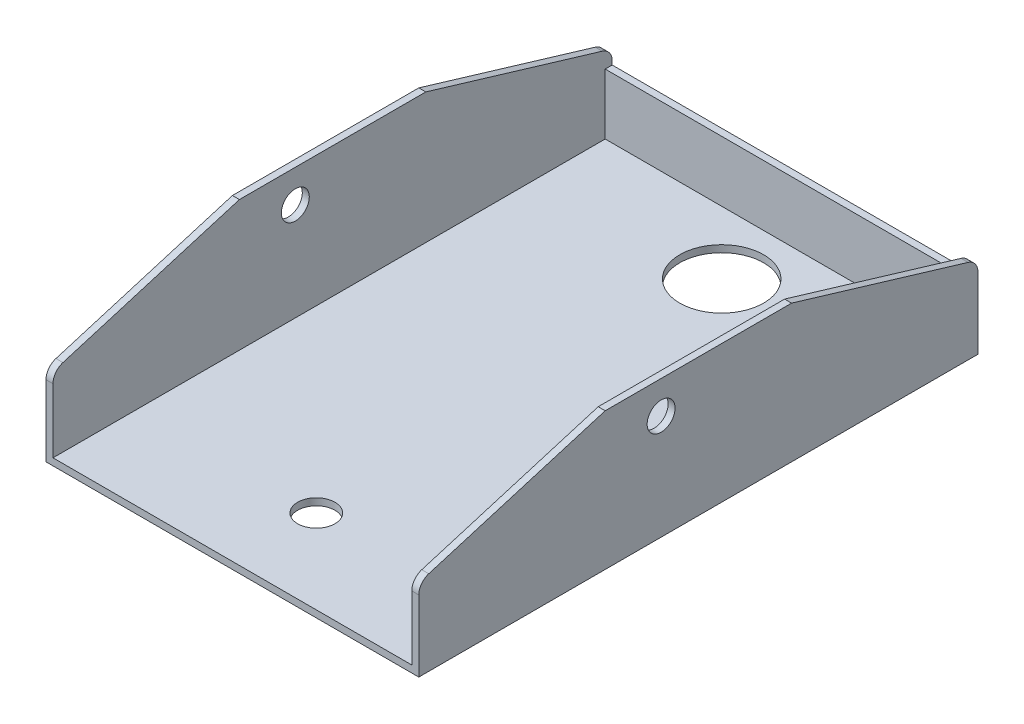
ISO-10303-21;
HEADER;
FILE_DESCRIPTION(('STEP AP214'),'2;1');
FILE_NAME('part.step','',(''),(''),'','','');
FILE_SCHEMA(('AUTOMOTIVE_DESIGN { 1 0 10303 214 1 1 1 1 }'));
ENDSEC;
DATA;
#1=APPLICATION_CONTEXT('core data for automotive mechanical design processes');
#2=APPLICATION_PROTOCOL_DEFINITION('international standard','automotive_design',2000,#1);
#3=PRODUCT_CONTEXT('',#1,'mechanical');
#4=PRODUCT('Part','Part','',(#3));
#5=PRODUCT_RELATED_PRODUCT_CATEGORY('part','',(#4));
#6=PRODUCT_DEFINITION_FORMATION('','',#4);
#7=PRODUCT_DEFINITION_CONTEXT('part definition',#1,'design');
#8=PRODUCT_DEFINITION('design','',#6,#7);
#9=PRODUCT_DEFINITION_SHAPE('','',#8);
#10=(LENGTH_UNIT() NAMED_UNIT(*) SI_UNIT(.MILLI.,.METRE.));
#11=(NAMED_UNIT(*) PLANE_ANGLE_UNIT() SI_UNIT($,.RADIAN.));
#12=(NAMED_UNIT(*) SI_UNIT($,.STERADIAN.) SOLID_ANGLE_UNIT());
#13=UNCERTAINTY_MEASURE_WITH_UNIT(LENGTH_MEASURE(1.E-05),#10,'distance_accuracy_value','');
#14=(GEOMETRIC_REPRESENTATION_CONTEXT(3) GLOBAL_UNCERTAINTY_ASSIGNED_CONTEXT((#13)) GLOBAL_UNIT_ASSIGNED_CONTEXT((#10,
#11,#12)) REPRESENTATION_CONTEXT('',''));
#15=CARTESIAN_POINT('',(0.,0.,0.));
#16=DIRECTION('',(0.,0.,1.));
#17=DIRECTION('',(1.,0.,0.));
#18=AXIS2_PLACEMENT_3D('',#15,#16,#17);
#19=CARTESIAN_POINT('',(0.,1.5,0.));
#20=DIRECTION('',(0.,-1.,0.));
#21=DIRECTION('',(0.,0.,-1.));
#22=AXIS2_PLACEMENT_3D('',#19,#20,#21);
#23=PLANE('',#22);
#24=CARTESIAN_POINT('',(0.,1.5,42.));
#25=DIRECTION('',(0.,1.,0.));
#26=DIRECTION('',(0.,0.,1.));
#27=AXIS2_PLACEMENT_3D('',#24,#25,#26);
#28=CIRCLE('',#27,4.);
#29=CARTESIAN_POINT('',(0.,1.5,46.));
#30=VERTEX_POINT('',#29);
#31=EDGE_CURVE('E222',#30,#30,#28,.T.);
#32=ORIENTED_EDGE('',*,*,#31,.F.);
#33=EDGE_LOOP('',(#32));
#34=FACE_BOUND('',#33,.T.);
#35=CARTESIAN_POINT('',(0.,1.5,-45.));
#36=DIRECTION('',(0.,1.,0.));
#37=DIRECTION('',(0.,0.,1.));
#38=AXIS2_PLACEMENT_3D('',#35,#36,#37);
#39=CIRCLE('',#38,9.);
#40=CARTESIAN_POINT('',(0.,1.5,-36.));
#41=VERTEX_POINT('',#40);
#42=EDGE_CURVE('E216',#41,#41,#39,.T.);
#43=ORIENTED_EDGE('',*,*,#42,.F.);
#44=EDGE_LOOP('',(#43));
#45=FACE_BOUND('',#44,.T.);
#46=DIRECTION('',(1.,0.,0.));
#47=VECTOR('',#46,1.);
#48=CARTESIAN_POINT('',(0.,1.5,-58.5));
#49=LINE('',#48,#47);
#50=CARTESIAN_POINT('',(-38.5,1.5,-58.5));
#51=VERTEX_POINT('',#50);
#52=CARTESIAN_POINT('',(38.5,1.5,-58.5));
#53=VERTEX_POINT('',#52);
#54=EDGE_CURVE('E299',#51,#53,#49,.T.);
#55=ORIENTED_EDGE('',*,*,#54,.F.);
#56=DIRECTION('',(0.,0.,1.));
#57=VECTOR('',#56,1.);
#58=CARTESIAN_POINT('',(-38.5,1.5,0.));
#59=LINE('',#58,#57);
#60=CARTESIAN_POINT('',(-38.5,1.5,60.));
#61=VERTEX_POINT('',#60);
#62=EDGE_CURVE('E202',#51,#61,#59,.T.);
#63=ORIENTED_EDGE('',*,*,#62,.T.);
#64=DIRECTION('',(1.,0.,0.));
#65=VECTOR('',#64,1.);
#66=CARTESIAN_POINT('',(-40.,1.5,60.));
#67=LINE('',#66,#65);
#68=CARTESIAN_POINT('',(38.5,1.5,60.));
#69=VERTEX_POINT('',#68);
#70=EDGE_CURVE('E228',#61,#69,#67,.T.);
#71=ORIENTED_EDGE('',*,*,#70,.T.);
#72=DIRECTION('',(0.,0.,1.));
#73=VECTOR('',#72,1.);
#74=CARTESIAN_POINT('',(38.5,1.5,0.));
#75=LINE('',#74,#73);
#76=EDGE_CURVE('E194',#53,#69,#75,.T.);
#77=ORIENTED_EDGE('',*,*,#76,.F.);
#78=EDGE_LOOP('',(#55,#63,#71,#77));
#79=FACE_BOUND('',#78,.T.);
#80=ADVANCED_FACE('F38',(#34,#45,#79),#23,.F.);
#81=CARTESIAN_POINT('',(-38.5,29.5,0.));
#82=DIRECTION('',(1.,0.,0.));
#83=DIRECTION('',(0.,0.,-1.));
#84=AXIS2_PLACEMENT_3D('',#81,#82,#83);
#85=PLANE('',#84);
#86=DIRECTION('',(0.,0.287347885566345,-0.957826285221152));
#87=VECTOR('',#86,1.);
#88=CARTESIAN_POINT('',(-38.5,35.0045871559633,1.65137614678899));
#89=LINE('',#88,#87);
#90=CARTESIAN_POINT('',(-38.5,18.1413869029903,57.862043656699));
#91=VERTEX_POINT('',#90);
#92=CARTESIAN_POINT('',(-38.5,29.5,20.));
#93=VERTEX_POINT('',#92);
#94=EDGE_CURVE('E352',#91,#93,#89,.T.);
#95=ORIENTED_EDGE('',*,*,#94,.F.);
#96=CARTESIAN_POINT('',(-38.5,15.2679080473268,57.));
#97=DIRECTION('',(1.,0.,0.));
#98=DIRECTION('',(0.,0.,-1.));
#99=AXIS2_PLACEMENT_3D('',#96,#97,#98);
#100=CIRCLE('',#99,3.);
#101=CARTESIAN_POINT('',(-38.5,15.2679080473268,60.));
#102=VERTEX_POINT('',#101);
#103=EDGE_CURVE('E269',#91,#102,#100,.T.);
#104=ORIENTED_EDGE('',*,*,#103,.T.);
#105=DIRECTION('',(0.,-1.,0.));
#106=VECTOR('',#105,1.);
#107=CARTESIAN_POINT('',(-38.5,29.5,60.));
#108=LINE('',#107,#106);
#109=EDGE_CURVE('E209',#102,#61,#108,.T.);
#110=ORIENTED_EDGE('',*,*,#109,.T.);
#111=ORIENTED_EDGE('',*,*,#62,.F.);
#112=DIRECTION('',(0.,-1.,0.));
#113=VECTOR('',#112,1.);
#114=CARTESIAN_POINT('',(-38.5,14.5,-58.5));
#115=LINE('',#114,#113);
#116=CARTESIAN_POINT('',(-38.5,14.5,-58.5));
#117=VERTEX_POINT('',#116);
#118=EDGE_CURVE('E199',#117,#51,#115,.T.);
#119=ORIENTED_EDGE('',*,*,#118,.F.);
#120=DIRECTION('',(0.,0.,1.));
#121=VECTOR('',#120,1.);
#122=CARTESIAN_POINT('',(-38.5,14.5,0.));
#123=LINE('',#122,#121);
#124=CARTESIAN_POINT('',(-38.5,14.5,-60.));
#125=VERTEX_POINT('',#124);
#126=EDGE_CURVE('E294',#125,#117,#123,.T.);
#127=ORIENTED_EDGE('',*,*,#126,.F.);
#128=DIRECTION('',(0.,-1.,0.));
#129=VECTOR('',#128,1.);
#130=CARTESIAN_POINT('',(-38.5,29.5,-60.));
#131=LINE('',#130,#129);
#132=CARTESIAN_POINT('',(-38.5,15.2679080473268,-60.));
#133=VERTEX_POINT('',#132);
#134=EDGE_CURVE('E213',#133,#125,#131,.T.);
#135=ORIENTED_EDGE('',*,*,#134,.F.);
#136=CARTESIAN_POINT('',(-38.5,15.2679080473268,-57.));
#137=DIRECTION('',(1.,0.,0.));
#138=DIRECTION('',(0.,0.,-1.));
#139=AXIS2_PLACEMENT_3D('',#136,#137,#138);
#140=CIRCLE('',#139,3.);
#141=CARTESIAN_POINT('',(-38.5,18.1413869029903,-57.862043656699));
#142=VERTEX_POINT('',#141);
#143=EDGE_CURVE('E267',#133,#142,#140,.T.);
#144=ORIENTED_EDGE('',*,*,#143,.T.);
#145=DIRECTION('',(0.,-0.287347885566345,-0.957826285221152));
#146=VECTOR('',#145,1.);
#147=CARTESIAN_POINT('',(-38.5,35.0045871559633,-1.65137614678899));
#148=LINE('',#147,#146);
#149=CARTESIAN_POINT('',(-38.5,29.5,-20.));
#150=VERTEX_POINT('',#149);
#151=EDGE_CURVE('E356',#150,#142,#148,.T.);
#152=ORIENTED_EDGE('',*,*,#151,.F.);
#153=DIRECTION('',(0.,0.,1.));
#154=VECTOR('',#153,1.);
#155=CARTESIAN_POINT('',(-38.5,29.5,0.));
#156=LINE('',#155,#154);
#157=EDGE_CURVE('E203',#150,#93,#156,.T.);
#158=ORIENTED_EDGE('',*,*,#157,.T.);
#159=EDGE_LOOP('',(#95,#104,#110,#111,#119,#127,#135,#144,#152,#158));
#160=FACE_BOUND('',#159,.T.);
#161=CARTESIAN_POINT('',(-38.5,22.5,7.99999999999999));
#162=DIRECTION('',(1.,0.,0.));
#163=DIRECTION('',(0.,0.,-1.));
#164=AXIS2_PLACEMENT_3D('',#161,#162,#163);
#165=CIRCLE('',#164,3.);
#166=CARTESIAN_POINT('',(-38.5,22.5,4.99999999999999));
#167=VERTEX_POINT('',#166);
#168=EDGE_CURVE('E303',#167,#167,#165,.T.);
#169=ORIENTED_EDGE('',*,*,#168,.F.);
#170=EDGE_LOOP('',(#169));
#171=FACE_BOUND('',#170,.T.);
#172=ADVANCED_FACE('F289',(#160,#171),#85,.T.);
#173=CARTESIAN_POINT('',(38.5,29.5,0.));
#174=DIRECTION('',(1.,0.,0.));
#175=DIRECTION('',(0.,0.,-1.));
#176=AXIS2_PLACEMENT_3D('',#173,#174,#175);
#177=PLANE('',#176);
#178=CARTESIAN_POINT('',(38.5,22.5,7.99999999999999));
#179=DIRECTION('',(1.,0.,0.));
#180=DIRECTION('',(0.,0.,-1.));
#181=AXIS2_PLACEMENT_3D('',#178,#179,#180);
#182=CIRCLE('',#181,3.);
#183=CARTESIAN_POINT('',(38.5,22.5,4.99999999999999));
#184=VERTEX_POINT('',#183);
#185=EDGE_CURVE('E357',#184,#184,#182,.T.);
#186=ORIENTED_EDGE('',*,*,#185,.T.);
#187=EDGE_LOOP('',(#186));
#188=FACE_BOUND('',#187,.T.);
#189=DIRECTION('',(0.,-1.,0.));
#190=VECTOR('',#189,1.);
#191=CARTESIAN_POINT('',(38.5,29.5,60.));
#192=LINE('',#191,#190);
#193=CARTESIAN_POINT('',(38.5,15.2679080473268,60.));
#194=VERTEX_POINT('',#193);
#195=EDGE_CURVE('E189',#194,#69,#192,.T.);
#196=ORIENTED_EDGE('',*,*,#195,.F.);
#197=CARTESIAN_POINT('',(38.5,15.2679080473268,57.));
#198=DIRECTION('',(1.,0.,0.));
#199=DIRECTION('',(0.,0.,-1.));
#200=AXIS2_PLACEMENT_3D('',#197,#198,#199);
#201=CIRCLE('',#200,3.);
#202=CARTESIAN_POINT('',(38.5,18.1413869029903,57.862043656699));
#203=VERTEX_POINT('',#202);
#204=EDGE_CURVE('E262',#194,#203,#201,.F.);
#205=ORIENTED_EDGE('',*,*,#204,.T.);
#206=DIRECTION('',(0.,0.287347885566345,-0.957826285221152));
#207=VECTOR('',#206,1.);
#208=CARTESIAN_POINT('',(38.5,35.0045871559633,1.65137614678899));
#209=LINE('',#208,#207);
#210=CARTESIAN_POINT('',(38.5,29.5,20.));
#211=VERTEX_POINT('',#210);
#212=EDGE_CURVE('E350',#203,#211,#209,.T.);
#213=ORIENTED_EDGE('',*,*,#212,.T.);
#214=DIRECTION('',(0.,0.,1.));
#215=VECTOR('',#214,1.);
#216=CARTESIAN_POINT('',(38.5,29.5,0.));
#217=LINE('',#216,#215);
#218=CARTESIAN_POINT('',(38.5,29.5,-20.));
#219=VERTEX_POINT('',#218);
#220=EDGE_CURVE('E190',#219,#211,#217,.T.);
#221=ORIENTED_EDGE('',*,*,#220,.F.);
#222=DIRECTION('',(0.,-0.287347885566345,-0.957826285221152));
#223=VECTOR('',#222,1.);
#224=CARTESIAN_POINT('',(38.5,35.0045871559633,-1.65137614678899));
#225=LINE('',#224,#223);
#226=CARTESIAN_POINT('',(38.5,18.1413869029903,-57.862043656699));
#227=VERTEX_POINT('',#226);
#228=EDGE_CURVE('E168',#219,#227,#225,.T.);
#229=ORIENTED_EDGE('',*,*,#228,.T.);
#230=CARTESIAN_POINT('',(38.5,15.2679080473268,-57.));
#231=DIRECTION('',(1.,0.,0.));
#232=DIRECTION('',(0.,0.,-1.));
#233=AXIS2_PLACEMENT_3D('',#230,#231,#232);
#234=CIRCLE('',#233,3.);
#235=CARTESIAN_POINT('',(38.5,15.2679080473268,-60.));
#236=VERTEX_POINT('',#235);
#237=EDGE_CURVE('E260',#227,#236,#234,.F.);
#238=ORIENTED_EDGE('',*,*,#237,.T.);
#239=DIRECTION('',(0.,-1.,0.));
#240=VECTOR('',#239,1.);
#241=CARTESIAN_POINT('',(38.5,29.5,-60.));
#242=LINE('',#241,#240);
#243=CARTESIAN_POINT('',(38.5,14.5,-60.));
#244=VERTEX_POINT('',#243);
#245=EDGE_CURVE('E192',#236,#244,#242,.T.);
#246=ORIENTED_EDGE('',*,*,#245,.T.);
#247=DIRECTION('',(0.,0.,1.));
#248=VECTOR('',#247,1.);
#249=CARTESIAN_POINT('',(38.5,14.5,0.));
#250=LINE('',#249,#248);
#251=CARTESIAN_POINT('',(38.5,14.5,-58.5));
#252=VERTEX_POINT('',#251);
#253=EDGE_CURVE('E301',#244,#252,#250,.T.);
#254=ORIENTED_EDGE('',*,*,#253,.T.);
#255=DIRECTION('',(0.,-1.,0.));
#256=VECTOR('',#255,1.);
#257=CARTESIAN_POINT('',(38.5,14.5,-58.5));
#258=LINE('',#257,#256);
#259=EDGE_CURVE('E311',#252,#53,#258,.T.);
#260=ORIENTED_EDGE('',*,*,#259,.T.);
#261=ORIENTED_EDGE('',*,*,#76,.T.);
#262=EDGE_LOOP('',(#196,#205,#213,#221,#229,#238,#246,#254,#260,#261));
#263=FACE_BOUND('',#262,.T.);
#264=ADVANCED_FACE('F367',(#188,#263),#177,.F.);
#265=CARTESIAN_POINT('',(0.,0.,0.));
#266=DIRECTION('',(0.,-1.,0.));
#267=DIRECTION('',(0.,0.,-1.));
#268=AXIS2_PLACEMENT_3D('',#265,#266,#267);
#269=PLANE('',#268);
#270=CARTESIAN_POINT('',(0.,0.,42.));
#271=DIRECTION('',(0.,1.,0.));
#272=DIRECTION('',(0.,0.,1.));
#273=AXIS2_PLACEMENT_3D('',#270,#271,#272);
#274=CIRCLE('',#273,4.);
#275=CARTESIAN_POINT('',(0.,0.,46.));
#276=VERTEX_POINT('',#275);
#277=EDGE_CURVE('E219',#276,#276,#274,.T.);
#278=ORIENTED_EDGE('',*,*,#277,.T.);
#279=EDGE_LOOP('',(#278));
#280=FACE_BOUND('',#279,.T.);
#281=DIRECTION('',(0.,0.,-1.));
#282=VECTOR('',#281,1.);
#283=CARTESIAN_POINT('',(40.,0.,60.));
#284=LINE('',#283,#282);
#285=CARTESIAN_POINT('',(40.,0.,60.));
#286=VERTEX_POINT('',#285);
#287=CARTESIAN_POINT('',(40.,0.,-60.));
#288=VERTEX_POINT('',#287);
#289=EDGE_CURVE('E225',#286,#288,#284,.T.);
#290=ORIENTED_EDGE('',*,*,#289,.F.);
#291=DIRECTION('',(1.,0.,0.));
#292=VECTOR('',#291,1.);
#293=CARTESIAN_POINT('',(-40.,0.,60.));
#294=LINE('',#293,#292);
#295=CARTESIAN_POINT('',(-40.,0.,60.));
#296=VERTEX_POINT('',#295);
#297=EDGE_CURVE('E232',#296,#286,#294,.T.);
#298=ORIENTED_EDGE('',*,*,#297,.F.);
#299=DIRECTION('',(0.,0.,1.));
#300=VECTOR('',#299,1.);
#301=CARTESIAN_POINT('',(-40.,0.,60.));
#302=LINE('',#301,#300);
#303=CARTESIAN_POINT('',(-40.,0.,-60.));
#304=VERTEX_POINT('',#303);
#305=EDGE_CURVE('E238',#304,#296,#302,.T.);
#306=ORIENTED_EDGE('',*,*,#305,.F.);
#307=DIRECTION('',(-1.,0.,0.));
#308=VECTOR('',#307,1.);
#309=CARTESIAN_POINT('',(-40.,0.,-60.));
#310=LINE('',#309,#308);
#311=EDGE_CURVE('E235',#288,#304,#310,.T.);
#312=ORIENTED_EDGE('',*,*,#311,.F.);
#313=EDGE_LOOP('',(#290,#298,#306,#312));
#314=FACE_BOUND('',#313,.T.);
#315=CARTESIAN_POINT('',(0.,0.,-45.));
#316=DIRECTION('',(0.,1.,0.));
#317=DIRECTION('',(0.,0.,1.));
#318=AXIS2_PLACEMENT_3D('',#315,#316,#317);
#319=CIRCLE('',#318,9.);
#320=CARTESIAN_POINT('',(0.,0.,-36.));
#321=VERTEX_POINT('',#320);
#322=EDGE_CURVE('E215',#321,#321,#319,.T.);
#323=ORIENTED_EDGE('',*,*,#322,.T.);
#324=EDGE_LOOP('',(#323));
#325=FACE_BOUND('',#324,.T.);
#326=ADVANCED_FACE('F373',(#280,#314,#325),#269,.T.);
#327=CARTESIAN_POINT('',(40.,1.5,60.));
#328=DIRECTION('',(-1.,0.,0.));
#329=DIRECTION('',(0.,0.,1.));
#330=AXIS2_PLACEMENT_3D('',#327,#328,#329);
#331=PLANE('',#330);
#332=CARTESIAN_POINT('',(40.,22.5,7.99999999999999));
#333=DIRECTION('',(1.,0.,0.));
#334=DIRECTION('',(0.,0.,-1.));
#335=AXIS2_PLACEMENT_3D('',#332,#333,#334);
#336=CIRCLE('',#335,3.);
#337=CARTESIAN_POINT('',(40.,22.5,4.99999999999999));
#338=VERTEX_POINT('',#337);
#339=EDGE_CURVE('E345',#338,#338,#336,.T.);
#340=ORIENTED_EDGE('',*,*,#339,.F.);
#341=EDGE_LOOP('',(#340));
#342=FACE_BOUND('',#341,.T.);
#343=DIRECTION('',(0.,0.287347885566345,-0.957826285221151));
#344=VECTOR('',#343,1.);
#345=CARTESIAN_POINT('',(40.,17.5,60.));
#346=LINE('',#345,#344);
#347=CARTESIAN_POINT('',(40.,18.1413869029903,57.862043656699));
#348=VERTEX_POINT('',#347);
#349=CARTESIAN_POINT('',(40.,29.5,20.));
#350=VERTEX_POINT('',#349);
#351=EDGE_CURVE('E338',#348,#350,#346,.T.);
#352=ORIENTED_EDGE('',*,*,#351,.F.);
#353=CARTESIAN_POINT('',(40.,15.2679080473268,57.));
#354=DIRECTION('',(-1.,0.,0.));
#355=DIRECTION('',(0.,0.,1.));
#356=AXIS2_PLACEMENT_3D('',#353,#354,#355);
#357=CIRCLE('',#356,3.);
#358=CARTESIAN_POINT('',(40.,15.2679080473268,60.));
#359=VERTEX_POINT('',#358);
#360=EDGE_CURVE('E254',#348,#359,#357,.F.);
#361=ORIENTED_EDGE('',*,*,#360,.T.);
#362=DIRECTION('',(0.,-1.,0.));
#363=VECTOR('',#362,1.);
#364=CARTESIAN_POINT('',(40.,1.5,60.));
#365=LINE('',#364,#363);
#366=EDGE_CURVE('E231',#359,#286,#365,.T.);
#367=ORIENTED_EDGE('',*,*,#366,.T.);
#368=ORIENTED_EDGE('',*,*,#289,.T.);
#369=DIRECTION('',(0.,-1.,0.));
#370=VECTOR('',#369,1.);
#371=CARTESIAN_POINT('',(40.,1.5,-60.));
#372=LINE('',#371,#370);
#373=CARTESIAN_POINT('',(40.,15.2679080473268,-60.));
#374=VERTEX_POINT('',#373);
#375=EDGE_CURVE('E248',#374,#288,#372,.T.);
#376=ORIENTED_EDGE('',*,*,#375,.F.);
#377=CARTESIAN_POINT('',(40.,15.2679080473268,-57.));
#378=DIRECTION('',(-1.,0.,0.));
#379=DIRECTION('',(0.,0.,1.));
#380=AXIS2_PLACEMENT_3D('',#377,#378,#379);
#381=CIRCLE('',#380,3.);
#382=CARTESIAN_POINT('',(40.,18.1413869029903,-57.862043656699));
#383=VERTEX_POINT('',#382);
#384=EDGE_CURVE('E182',#374,#383,#381,.F.);
#385=ORIENTED_EDGE('',*,*,#384,.T.);
#386=DIRECTION('',(0.,-0.287347885566345,-0.957826285221151));
#387=VECTOR('',#386,1.);
#388=CARTESIAN_POINT('',(40.,17.5,-60.));
#389=LINE('',#388,#387);
#390=CARTESIAN_POINT('',(40.,29.5,-20.));
#391=VERTEX_POINT('',#390);
#392=EDGE_CURVE('E165',#391,#383,#389,.T.);
#393=ORIENTED_EDGE('',*,*,#392,.F.);
#394=DIRECTION('',(0.,0.,-1.));
#395=VECTOR('',#394,1.);
#396=CARTESIAN_POINT('',(40.,29.5,0.));
#397=LINE('',#396,#395);
#398=EDGE_CURVE('E180',#350,#391,#397,.T.);
#399=ORIENTED_EDGE('',*,*,#398,.F.);
#400=EDGE_LOOP('',(#352,#361,#367,#368,#376,#385,#393,#399));
#401=FACE_BOUND('',#400,.T.);
#402=ADVANCED_FACE('F179',(#342,#401),#331,.F.);
#403=CARTESIAN_POINT('',(-40.,1.5,-60.));
#404=DIRECTION('',(0.,0.,1.));
#405=DIRECTION('',(1.,0.,0.));
#406=AXIS2_PLACEMENT_3D('',#403,#404,#405);
#407=PLANE('',#406);
#408=DIRECTION('',(0.,-1.,0.));
#409=VECTOR('',#408,1.);
#410=CARTESIAN_POINT('',(-40.,1.5,-60.));
#411=LINE('',#410,#409);
#412=CARTESIAN_POINT('',(-40.,15.2679080473268,-60.));
#413=VERTEX_POINT('',#412);
#414=EDGE_CURVE('E246',#413,#304,#411,.T.);
#415=ORIENTED_EDGE('',*,*,#414,.F.);
#416=DIRECTION('',(1.,0.,0.));
#417=VECTOR('',#416,1.);
#418=CARTESIAN_POINT('',(-40.,15.2679080473268,-60.));
#419=LINE('',#418,#417);
#420=EDGE_CURVE('E277',#413,#133,#419,.T.);
#421=ORIENTED_EDGE('',*,*,#420,.T.);
#422=ORIENTED_EDGE('',*,*,#134,.T.);
#423=DIRECTION('',(-1.,0.,0.));
#424=VECTOR('',#423,1.);
#425=CARTESIAN_POINT('',(0.,14.5,-60.));
#426=LINE('',#425,#424);
#427=EDGE_CURVE('E310',#244,#125,#426,.T.);
#428=ORIENTED_EDGE('',*,*,#427,.F.);
#429=ORIENTED_EDGE('',*,*,#245,.F.);
#430=DIRECTION('',(1.,0.,0.));
#431=VECTOR('',#430,1.);
#432=CARTESIAN_POINT('',(-40.,15.2679080473268,-60.));
#433=LINE('',#432,#431);
#434=EDGE_CURVE('E274',#236,#374,#433,.T.);
#435=ORIENTED_EDGE('',*,*,#434,.T.);
#436=ORIENTED_EDGE('',*,*,#375,.T.);
#437=ORIENTED_EDGE('',*,*,#311,.T.);
#438=EDGE_LOOP('',(#415,#421,#422,#428,#429,#435,#436,#437));
#439=FACE_BOUND('',#438,.T.);
#440=ADVANCED_FACE('F282',(#439),#407,.F.);
#441=CARTESIAN_POINT('',(-40.,1.5,60.));
#442=DIRECTION('',(1.,0.,0.));
#443=DIRECTION('',(0.,0.,-1.));
#444=AXIS2_PLACEMENT_3D('',#441,#442,#443);
#445=PLANE('',#444);
#446=CARTESIAN_POINT('',(-40.,22.5,7.99999999999999));
#447=DIRECTION('',(1.,0.,0.));
#448=DIRECTION('',(0.,0.,-1.));
#449=AXIS2_PLACEMENT_3D('',#446,#447,#448);
#450=CIRCLE('',#449,3.);
#451=CARTESIAN_POINT('',(-40.,22.5,4.99999999999999));
#452=VERTEX_POINT('',#451);
#453=EDGE_CURVE('E341',#452,#452,#450,.T.);
#454=ORIENTED_EDGE('',*,*,#453,.T.);
#455=EDGE_LOOP('',(#454));
#456=FACE_BOUND('',#455,.T.);
#457=DIRECTION('',(0.,-1.,0.));
#458=VECTOR('',#457,1.);
#459=CARTESIAN_POINT('',(-40.,1.5,60.));
#460=LINE('',#459,#458);
#461=CARTESIAN_POINT('',(-40.,15.2679080473268,60.));
#462=VERTEX_POINT('',#461);
#463=EDGE_CURVE('E244',#462,#296,#460,.T.);
#464=ORIENTED_EDGE('',*,*,#463,.F.);
#465=CARTESIAN_POINT('',(-40.,15.2679080473268,57.));
#466=DIRECTION('',(1.,0.,0.));
#467=DIRECTION('',(0.,0.,-1.));
#468=AXIS2_PLACEMENT_3D('',#465,#466,#467);
#469=CIRCLE('',#468,3.);
#470=CARTESIAN_POINT('',(-40.,18.1413869029903,57.862043656699));
#471=VERTEX_POINT('',#470);
#472=EDGE_CURVE('E272',#462,#471,#469,.F.);
#473=ORIENTED_EDGE('',*,*,#472,.T.);
#474=DIRECTION('',(0.,0.287347885566345,-0.957826285221151));
#475=VECTOR('',#474,1.);
#476=CARTESIAN_POINT('',(-40.,17.5,60.));
#477=LINE('',#476,#475);
#478=CARTESIAN_POINT('',(-40.,29.5,20.));
#479=VERTEX_POINT('',#478);
#480=EDGE_CURVE('E333',#471,#479,#477,.T.);
#481=ORIENTED_EDGE('',*,*,#480,.T.);
#482=DIRECTION('',(0.,0.,1.));
#483=VECTOR('',#482,1.);
#484=CARTESIAN_POINT('',(-40.,29.5,0.));
#485=LINE('',#484,#483);
#486=CARTESIAN_POINT('',(-40.,29.5,-20.));
#487=VERTEX_POINT('',#486);
#488=EDGE_CURVE('E206',#487,#479,#485,.T.);
#489=ORIENTED_EDGE('',*,*,#488,.F.);
#490=DIRECTION('',(0.,-0.287347885566345,-0.957826285221151));
#491=VECTOR('',#490,1.);
#492=CARTESIAN_POINT('',(-40.,17.5,-60.));
#493=LINE('',#492,#491);
#494=CARTESIAN_POINT('',(-40.,18.1413869029903,-57.862043656699));
#495=VERTEX_POINT('',#494);
#496=EDGE_CURVE('E183',#487,#495,#493,.T.);
#497=ORIENTED_EDGE('',*,*,#496,.T.);
#498=CARTESIAN_POINT('',(-40.,15.2679080473268,-57.));
#499=DIRECTION('',(1.,0.,0.));
#500=DIRECTION('',(0.,0.,-1.));
#501=AXIS2_PLACEMENT_3D('',#498,#499,#500);
#502=CIRCLE('',#501,3.);
#503=EDGE_CURVE('E53',#495,#413,#502,.F.);
#504=ORIENTED_EDGE('',*,*,#503,.T.);
#505=ORIENTED_EDGE('',*,*,#414,.T.);
#506=ORIENTED_EDGE('',*,*,#305,.T.);
#507=EDGE_LOOP('',(#464,#473,#481,#489,#497,#504,#505,#506));
#508=FACE_BOUND('',#507,.T.);
#509=ADVANCED_FACE('F331',(#456,#508),#445,.F.);
#510=CARTESIAN_POINT('',(-40.,1.5,60.));
#511=DIRECTION('',(0.,0.,-1.));
#512=DIRECTION('',(-1.,0.,0.));
#513=AXIS2_PLACEMENT_3D('',#510,#511,#512);
#514=PLANE('',#513);
#515=ORIENTED_EDGE('',*,*,#366,.F.);
#516=DIRECTION('',(1.,0.,0.));
#517=VECTOR('',#516,1.);
#518=CARTESIAN_POINT('',(-40.,15.2679080473268,60.));
#519=LINE('',#518,#517);
#520=EDGE_CURVE('E258',#359,#194,#519,.F.);
#521=ORIENTED_EDGE('',*,*,#520,.T.);
#522=ORIENTED_EDGE('',*,*,#195,.T.);
#523=ORIENTED_EDGE('',*,*,#70,.F.);
#524=ORIENTED_EDGE('',*,*,#109,.F.);
#525=DIRECTION('',(1.,0.,0.));
#526=VECTOR('',#525,1.);
#527=CARTESIAN_POINT('',(-40.,15.2679080473268,60.));
#528=LINE('',#527,#526);
#529=EDGE_CURVE('E256',#102,#462,#528,.F.);
#530=ORIENTED_EDGE('',*,*,#529,.T.);
#531=ORIENTED_EDGE('',*,*,#463,.T.);
#532=ORIENTED_EDGE('',*,*,#297,.T.);
#533=EDGE_LOOP('',(#515,#521,#522,#523,#524,#530,#531,#532));
#534=FACE_BOUND('',#533,.T.);
#535=ADVANCED_FACE('F324',(#534),#514,.F.);
#536=CARTESIAN_POINT('',(0.,1.5,42.));
#537=DIRECTION('',(0.,-1.,0.));
#538=DIRECTION('',(0.,0.,-1.));
#539=AXIS2_PLACEMENT_3D('',#536,#537,#538);
#540=CYLINDRICAL_SURFACE('',#539,4.);
#541=ORIENTED_EDGE('',*,*,#31,.T.);
#542=EDGE_LOOP('',(#541));
#543=FACE_BOUND('',#542,.T.);
#544=ORIENTED_EDGE('',*,*,#277,.F.);
#545=EDGE_LOOP('',(#544));
#546=FACE_BOUND('',#545,.T.);
#547=ADVANCED_FACE('F383',(#543,#546),#540,.F.);
#548=CARTESIAN_POINT('',(0.,1.5,-45.));
#549=DIRECTION('',(0.,-1.,0.));
#550=DIRECTION('',(0.,0.,-1.));
#551=AXIS2_PLACEMENT_3D('',#548,#549,#550);
#552=CYLINDRICAL_SURFACE('',#551,9.);
#553=ORIENTED_EDGE('',*,*,#42,.T.);
#554=EDGE_LOOP('',(#553));
#555=FACE_BOUND('',#554,.T.);
#556=ORIENTED_EDGE('',*,*,#322,.F.);
#557=EDGE_LOOP('',(#556));
#558=FACE_BOUND('',#557,.T.);
#559=ADVANCED_FACE('F380',(#555,#558),#552,.F.);
#560=CARTESIAN_POINT('',(0.,29.5,0.));
#561=DIRECTION('',(0.,1.,0.));
#562=DIRECTION('',(0.,0.,1.));
#563=AXIS2_PLACEMENT_3D('',#560,#561,#562);
#564=PLANE('',#563);
#565=DIRECTION('',(1.,0.,0.));
#566=VECTOR('',#565,1.);
#567=CARTESIAN_POINT('',(-40.,29.5,-20.));
#568=LINE('',#567,#566);
#569=EDGE_CURVE('E353',#487,#150,#568,.T.);
#570=ORIENTED_EDGE('',*,*,#569,.F.);
#571=ORIENTED_EDGE('',*,*,#488,.T.);
#572=DIRECTION('',(1.,0.,0.));
#573=VECTOR('',#572,1.);
#574=CARTESIAN_POINT('',(-40.,29.5,20.));
#575=LINE('',#574,#573);
#576=EDGE_CURVE('E184',#479,#93,#575,.T.);
#577=ORIENTED_EDGE('',*,*,#576,.T.);
#578=ORIENTED_EDGE('',*,*,#157,.F.);
#579=EDGE_LOOP('',(#570,#571,#577,#578));
#580=FACE_BOUND('',#579,.T.);
#581=ADVANCED_FACE('F379',(#580),#564,.T.);
#582=CARTESIAN_POINT('',(0.,29.5,0.));
#583=DIRECTION('',(0.,1.,0.));
#584=DIRECTION('',(0.,0.,1.));
#585=AXIS2_PLACEMENT_3D('',#582,#583,#584);
#586=PLANE('',#585);
#587=DIRECTION('',(1.,0.,0.));
#588=VECTOR('',#587,1.);
#589=CARTESIAN_POINT('',(0.,29.5,-20.));
#590=LINE('',#589,#588);
#591=EDGE_CURVE('E162',#219,#391,#590,.T.);
#592=ORIENTED_EDGE('',*,*,#591,.F.);
#593=ORIENTED_EDGE('',*,*,#220,.T.);
#594=DIRECTION('',(-1.,0.,0.));
#595=VECTOR('',#594,1.);
#596=CARTESIAN_POINT('',(0.,29.5,20.));
#597=LINE('',#596,#595);
#598=EDGE_CURVE('E174',#350,#211,#597,.T.);
#599=ORIENTED_EDGE('',*,*,#598,.F.);
#600=ORIENTED_EDGE('',*,*,#398,.T.);
#601=EDGE_LOOP('',(#592,#593,#599,#600));
#602=FACE_BOUND('',#601,.T.);
#603=ADVANCED_FACE('F187',(#602),#586,.T.);
#604=CARTESIAN_POINT('',(0.,14.5,-58.5));
#605=DIRECTION('',(0.,0.,-1.));
#606=DIRECTION('',(-1.,0.,0.));
#607=AXIS2_PLACEMENT_3D('',#604,#605,#606);
#608=PLANE('',#607);
#609=ORIENTED_EDGE('',*,*,#54,.T.);
#610=ORIENTED_EDGE('',*,*,#259,.F.);
#611=DIRECTION('',(1.,0.,0.));
#612=VECTOR('',#611,1.);
#613=CARTESIAN_POINT('',(0.,14.5,-58.5));
#614=LINE('',#613,#612);
#615=EDGE_CURVE('E298',#117,#252,#614,.T.);
#616=ORIENTED_EDGE('',*,*,#615,.F.);
#617=ORIENTED_EDGE('',*,*,#118,.T.);
#618=EDGE_LOOP('',(#609,#610,#616,#617));
#619=FACE_BOUND('',#618,.T.);
#620=ADVANCED_FACE('F316',(#619),#608,.F.);
#621=CARTESIAN_POINT('',(0.,14.5,0.));
#622=DIRECTION('',(0.,1.,0.));
#623=DIRECTION('',(0.,0.,1.));
#624=AXIS2_PLACEMENT_3D('',#621,#622,#623);
#625=PLANE('',#624);
#626=ORIENTED_EDGE('',*,*,#126,.T.);
#627=ORIENTED_EDGE('',*,*,#615,.T.);
#628=ORIENTED_EDGE('',*,*,#253,.F.);
#629=ORIENTED_EDGE('',*,*,#427,.T.);
#630=EDGE_LOOP('',(#626,#627,#628,#629));
#631=FACE_BOUND('',#630,.T.);
#632=ADVANCED_FACE('F421',(#631),#625,.T.);
#633=CARTESIAN_POINT('',(-40.,17.5,60.));
#634=DIRECTION('',(0.,-0.957826285221151,-0.287347885566345));
#635=DIRECTION('',(0.,0.287347885566345,-0.957826285221152));
#636=AXIS2_PLACEMENT_3D('',#633,#634,#635);
#637=PLANE('',#636);
#638=ORIENTED_EDGE('',*,*,#212,.F.);
#639=DIRECTION('',(1.,0.,0.));
#640=VECTOR('',#639,1.);
#641=CARTESIAN_POINT('',(-40.,18.1413869029903,57.862043656699));
#642=LINE('',#641,#640);
#643=EDGE_CURVE('E173',#203,#348,#642,.T.);
#644=ORIENTED_EDGE('',*,*,#643,.T.);
#645=ORIENTED_EDGE('',*,*,#351,.T.);
#646=ORIENTED_EDGE('',*,*,#598,.T.);
#647=EDGE_LOOP('',(#638,#644,#645,#646));
#648=FACE_BOUND('',#647,.T.);
#649=ADVANCED_FACE('F427',(#648),#637,.F.);
#650=CARTESIAN_POINT('',(-40.,17.5,-60.));
#651=DIRECTION('',(0.,-0.957826285221151,0.287347885566345));
#652=DIRECTION('',(0.,-0.287347885566345,-0.957826285221152));
#653=AXIS2_PLACEMENT_3D('',#650,#651,#652);
#654=PLANE('',#653);
#655=ORIENTED_EDGE('',*,*,#392,.T.);
#656=DIRECTION('',(1.,0.,0.));
#657=VECTOR('',#656,1.);
#658=CARTESIAN_POINT('',(-40.,18.1413869029903,-57.862043656699));
#659=LINE('',#658,#657);
#660=EDGE_CURVE('E11',#383,#227,#659,.F.);
#661=ORIENTED_EDGE('',*,*,#660,.T.);
#662=ORIENTED_EDGE('',*,*,#228,.F.);
#663=ORIENTED_EDGE('',*,*,#591,.T.);
#664=EDGE_LOOP('',(#655,#661,#662,#663));
#665=FACE_BOUND('',#664,.T.);
#666=ADVANCED_FACE('F164',(#665),#654,.F.);
#667=ORIENTED_EDGE('',*,*,#480,.F.);
#668=DIRECTION('',(1.,0.,0.));
#669=VECTOR('',#668,1.);
#670=CARTESIAN_POINT('',(-40.,18.1413869029903,57.862043656699));
#671=LINE('',#670,#669);
#672=EDGE_CURVE('E264',#471,#91,#671,.T.);
#673=ORIENTED_EDGE('',*,*,#672,.T.);
#674=ORIENTED_EDGE('',*,*,#94,.T.);
#675=ORIENTED_EDGE('',*,*,#576,.F.);
#676=EDGE_LOOP('',(#667,#673,#674,#675));
#677=FACE_BOUND('',#676,.T.);
#678=ADVANCED_FACE('F336',(#677),#637,.F.);
#679=ORIENTED_EDGE('',*,*,#151,.T.);
#680=DIRECTION('',(1.,0.,0.));
#681=VECTOR('',#680,1.);
#682=CARTESIAN_POINT('',(-40.,18.1413869029903,-57.862043656699));
#683=LINE('',#682,#681);
#684=EDGE_CURVE('E46',#142,#495,#683,.F.);
#685=ORIENTED_EDGE('',*,*,#684,.T.);
#686=ORIENTED_EDGE('',*,*,#496,.F.);
#687=ORIENTED_EDGE('',*,*,#569,.T.);
#688=EDGE_LOOP('',(#679,#685,#686,#687));
#689=FACE_BOUND('',#688,.T.);
#690=ADVANCED_FACE('F443',(#689),#654,.F.);
#691=CARTESIAN_POINT('',(-40.,22.5,7.99999999999999));
#692=DIRECTION('',(1.,0.,0.));
#693=DIRECTION('',(0.,0.,-1.));
#694=AXIS2_PLACEMENT_3D('',#691,#692,#693);
#695=CYLINDRICAL_SURFACE('',#694,3.);
#696=ORIENTED_EDGE('',*,*,#168,.T.);
#697=EDGE_LOOP('',(#696));
#698=FACE_BOUND('',#697,.T.);
#699=ORIENTED_EDGE('',*,*,#453,.F.);
#700=EDGE_LOOP('',(#699));
#701=FACE_BOUND('',#700,.T.);
#702=ADVANCED_FACE('F364',(#698,#701),#695,.F.);
#703=ORIENTED_EDGE('',*,*,#339,.T.);
#704=EDGE_LOOP('',(#703));
#705=FACE_BOUND('',#704,.T.);
#706=ORIENTED_EDGE('',*,*,#185,.F.);
#707=EDGE_LOOP('',(#706));
#708=FACE_BOUND('',#707,.T.);
#709=ADVANCED_FACE('F404',(#705,#708),#695,.F.);
#710=CARTESIAN_POINT('',(-40.,15.2679080473268,57.));
#711=DIRECTION('',(1.,0.,0.));
#712=DIRECTION('',(0.,0.,-1.));
#713=AXIS2_PLACEMENT_3D('',#710,#711,#712);
#714=CYLINDRICAL_SURFACE('',#713,3.);
#715=ORIENTED_EDGE('',*,*,#204,.F.);
#716=ORIENTED_EDGE('',*,*,#520,.F.);
#717=ORIENTED_EDGE('',*,*,#360,.F.);
#718=ORIENTED_EDGE('',*,*,#643,.F.);
#719=EDGE_LOOP('',(#715,#716,#717,#718));
#720=FACE_BOUND('',#719,.T.);
#721=ADVANCED_FACE('F401',(#720),#714,.T.);
#722=CARTESIAN_POINT('',(-40.,15.2679080473268,57.));
#723=DIRECTION('',(1.,0.,0.));
#724=DIRECTION('',(0.,0.,-1.));
#725=AXIS2_PLACEMENT_3D('',#722,#723,#724);
#726=CYLINDRICAL_SURFACE('',#725,3.);
#727=ORIENTED_EDGE('',*,*,#472,.F.);
#728=ORIENTED_EDGE('',*,*,#529,.F.);
#729=ORIENTED_EDGE('',*,*,#103,.F.);
#730=ORIENTED_EDGE('',*,*,#672,.F.);
#731=EDGE_LOOP('',(#727,#728,#729,#730));
#732=FACE_BOUND('',#731,.T.);
#733=ADVANCED_FACE('F328',(#732),#726,.T.);
#734=CARTESIAN_POINT('',(-40.,15.2679080473268,-57.));
#735=DIRECTION('',(1.,0.,0.));
#736=DIRECTION('',(0.,0.,-1.));
#737=AXIS2_PLACEMENT_3D('',#734,#735,#736);
#738=CYLINDRICAL_SURFACE('',#737,3.);
#739=ORIENTED_EDGE('',*,*,#503,.F.);
#740=ORIENTED_EDGE('',*,*,#684,.F.);
#741=ORIENTED_EDGE('',*,*,#143,.F.);
#742=ORIENTED_EDGE('',*,*,#420,.F.);
#743=EDGE_LOOP('',(#739,#740,#741,#742));
#744=FACE_BOUND('',#743,.T.);
#745=ADVANCED_FACE('F407',(#744),#738,.T.);
#746=CARTESIAN_POINT('',(-40.,15.2679080473268,-57.));
#747=DIRECTION('',(1.,0.,0.));
#748=DIRECTION('',(0.,0.,-1.));
#749=AXIS2_PLACEMENT_3D('',#746,#747,#748);
#750=CYLINDRICAL_SURFACE('',#749,3.);
#751=ORIENTED_EDGE('',*,*,#237,.F.);
#752=ORIENTED_EDGE('',*,*,#660,.F.);
#753=ORIENTED_EDGE('',*,*,#384,.F.);
#754=ORIENTED_EDGE('',*,*,#434,.F.);
#755=EDGE_LOOP('',(#751,#752,#753,#754));
#756=FACE_BOUND('',#755,.T.);
#757=ADVANCED_FACE('F40',(#756),#750,.T.);
#758=CLOSED_SHELL('',(#80,#172,#264,#326,#402,#440,#509,#535,#547,#559,#581,#603,#620,#632,#649,
#666,#678,#690,#702,#709,#721,#733,#745,#757));
#759=MANIFOLD_SOLID_BREP('B2',#758);
#760=ADVANCED_BREP_SHAPE_REPRESENTATION('',(#18,#759),#14);
#761=SHAPE_DEFINITION_REPRESENTATION(#9,#760);
ENDSEC;
END-ISO-10303-21;
